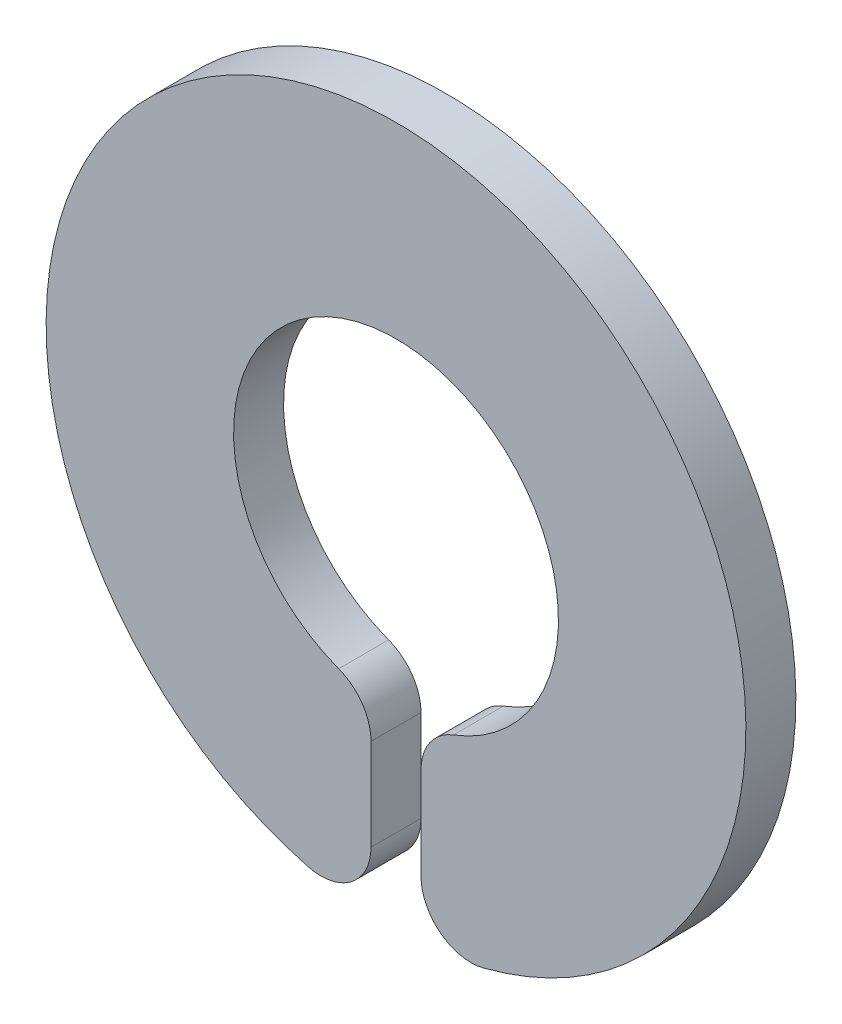
ISO-10303-21;
HEADER;
FILE_DESCRIPTION(('STEP AP214'),'2;1');
FILE_NAME('part.step','',(''),(''),'','','');
FILE_SCHEMA(('AUTOMOTIVE_DESIGN { 1 0 10303 214 1 1 1 1 }'));
ENDSEC;
DATA;
#1=APPLICATION_CONTEXT('core data for automotive mechanical design processes');
#2=APPLICATION_PROTOCOL_DEFINITION('international standard','automotive_design',2000,#1);
#3=PRODUCT_CONTEXT('',#1,'mechanical');
#4=PRODUCT('Part','Part','',(#3));
#5=PRODUCT_RELATED_PRODUCT_CATEGORY('part','',(#4));
#6=PRODUCT_DEFINITION_FORMATION('','',#4);
#7=PRODUCT_DEFINITION_CONTEXT('part definition',#1,'design');
#8=PRODUCT_DEFINITION('design','',#6,#7);
#9=PRODUCT_DEFINITION_SHAPE('','',#8);
#10=(LENGTH_UNIT() NAMED_UNIT(*) SI_UNIT(.MILLI.,.METRE.));
#11=(NAMED_UNIT(*) PLANE_ANGLE_UNIT() SI_UNIT($,.RADIAN.));
#12=(NAMED_UNIT(*) SI_UNIT($,.STERADIAN.) SOLID_ANGLE_UNIT());
#13=UNCERTAINTY_MEASURE_WITH_UNIT(LENGTH_MEASURE(1.E-05),#10,'distance_accuracy_value','');
#14=(GEOMETRIC_REPRESENTATION_CONTEXT(3) GLOBAL_UNCERTAINTY_ASSIGNED_CONTEXT((#13)) GLOBAL_UNIT_ASSIGNED_CONTEXT((#10,
#11,#12)) REPRESENTATION_CONTEXT('',''));
#15=CARTESIAN_POINT('',(0.,0.,0.));
#16=DIRECTION('',(0.,0.,1.));
#17=DIRECTION('',(1.,0.,0.));
#18=AXIS2_PLACEMENT_3D('',#15,#16,#17);
#19=CARTESIAN_POINT('',(0.,0.,1.));
#20=DIRECTION('',(0.,0.,-1.));
#21=DIRECTION('',(-1.,0.,0.));
#22=AXIS2_PLACEMENT_3D('',#19,#20,#21);
#23=CYLINDRICAL_SURFACE('',#22,3.25);
#24=CARTESIAN_POINT('',(0.,0.,0.));
#25=DIRECTION('',(0.,0.,-1.));
#26=DIRECTION('',(1.,0.,0.));
#27=AXIS2_PLACEMENT_3D('',#24,#25,#26);
#28=CIRCLE('',#27,3.25);
#29=CARTESIAN_POINT('',(-1.14705882352941,-3.04084791717102,0.));
#30=VERTEX_POINT('',#29);
#31=CARTESIAN_POINT('',(1.14705882352941,-3.04084791717102,0.));
#32=VERTEX_POINT('',#31);
#33=EDGE_CURVE('E128',#30,#32,#28,.T.);
#34=ORIENTED_EDGE('',*,*,#33,.T.);
#35=DIRECTION('',(0.,0.,-1.));
#36=VECTOR('',#35,1.);
#37=CARTESIAN_POINT('',(1.14705882352941,-3.04084791717102,1.));
#38=LINE('',#37,#36);
#39=CARTESIAN_POINT('',(1.14705882352941,-3.04084791717102,1.));
#40=VERTEX_POINT('',#39);
#41=EDGE_CURVE('E11',#32,#40,#38,.F.);
#42=ORIENTED_EDGE('',*,*,#41,.T.);
#43=CARTESIAN_POINT('',(0.,0.,1.));
#44=DIRECTION('',(0.,0.,-1.));
#45=DIRECTION('',(1.,0.,0.));
#46=AXIS2_PLACEMENT_3D('',#43,#44,#45);
#47=CIRCLE('',#46,3.25);
#48=CARTESIAN_POINT('',(-1.14705882352941,-3.04084791717102,1.));
#49=VERTEX_POINT('',#48);
#50=EDGE_CURVE('E126',#49,#40,#47,.T.);
#51=ORIENTED_EDGE('',*,*,#50,.F.);
#52=DIRECTION('',(0.,0.,-1.));
#53=VECTOR('',#52,1.);
#54=CARTESIAN_POINT('',(-1.14705882352941,-3.04084791717102,1.));
#55=LINE('',#54,#53);
#56=EDGE_CURVE('E40',#49,#30,#55,.T.);
#57=ORIENTED_EDGE('',*,*,#56,.T.);
#58=EDGE_LOOP('',(#34,#42,#51,#57));
#59=FACE_BOUND('',#58,.T.);
#60=ADVANCED_FACE('F32',(#59),#23,.F.);
#61=CARTESIAN_POINT('',(0.499999999999999,-3.21130814466628,1.));
#62=DIRECTION('',(1.,0.,0.));
#63=DIRECTION('',(0.,1.,0.));
#64=AXIS2_PLACEMENT_3D('',#61,#62,#63);
#65=PLANE('',#64);
#66=DIRECTION('',(0.,-1.,0.));
#67=VECTOR('',#66,1.);
#68=CARTESIAN_POINT('',(0.499999999999999,-3.21130814466628,0.));
#69=LINE('',#68,#67);
#70=CARTESIAN_POINT('',(0.499999999999999,-3.97649343014672,0.));
#71=VERTEX_POINT('',#70);
#72=CARTESIAN_POINT('',(0.499999999999999,-5.80947501931113,0.));
#73=VERTEX_POINT('',#72);
#74=EDGE_CURVE('E124',#71,#73,#69,.T.);
#75=ORIENTED_EDGE('',*,*,#74,.T.);
#76=DIRECTION('',(0.,0.,-1.));
#77=VECTOR('',#76,1.);
#78=CARTESIAN_POINT('',(0.499999999999999,-5.80947501931113,1.));
#79=LINE('',#78,#77);
#80=CARTESIAN_POINT('',(0.499999999999999,-5.80947501931113,1.));
#81=VERTEX_POINT('',#80);
#82=EDGE_CURVE('E103',#73,#81,#79,.F.);
#83=ORIENTED_EDGE('',*,*,#82,.T.);
#84=DIRECTION('',(0.,-1.,0.));
#85=VECTOR('',#84,1.);
#86=CARTESIAN_POINT('',(0.499999999999999,-3.21130814466628,1.));
#87=LINE('',#86,#85);
#88=CARTESIAN_POINT('',(0.499999999999999,-3.97649343014672,1.));
#89=VERTEX_POINT('',#88);
#90=EDGE_CURVE('E164',#89,#81,#87,.T.);
#91=ORIENTED_EDGE('',*,*,#90,.F.);
#92=DIRECTION('',(0.,0.,-1.));
#93=VECTOR('',#92,1.);
#94=CARTESIAN_POINT('',(0.499999999999999,-3.97649343014672,1.));
#95=LINE('',#94,#93);
#96=EDGE_CURVE('E108',#89,#71,#95,.T.);
#97=ORIENTED_EDGE('',*,*,#96,.T.);
#98=EDGE_LOOP('',(#75,#83,#91,#97));
#99=FACE_BOUND('',#98,.T.);
#100=ADVANCED_FACE('F174',(#99),#65,.F.);
#101=CARTESIAN_POINT('',(0.,0.,1.));
#102=DIRECTION('',(0.,0.,-1.));
#103=DIRECTION('',(-1.,0.,0.));
#104=AXIS2_PLACEMENT_3D('',#101,#102,#103);
#105=CYLINDRICAL_SURFACE('',#104,7.);
#106=CARTESIAN_POINT('',(0.,0.,1.));
#107=DIRECTION('',(0.,0.,1.));
#108=DIRECTION('',(1.,0.,0.));
#109=AXIS2_PLACEMENT_3D('',#106,#107,#108);
#110=CIRCLE('',#109,7.);
#111=CARTESIAN_POINT('',(1.75,-6.77772085586298,1.));
#112=VERTEX_POINT('',#111);
#113=CARTESIAN_POINT('',(-1.75,-6.77772085586298,1.));
#114=VERTEX_POINT('',#113);
#115=EDGE_CURVE('E117',#112,#114,#110,.T.);
#116=ORIENTED_EDGE('',*,*,#115,.F.);
#117=DIRECTION('',(0.,0.,-1.));
#118=VECTOR('',#117,1.);
#119=CARTESIAN_POINT('',(1.75,-6.77772085586298,1.));
#120=LINE('',#119,#118);
#121=CARTESIAN_POINT('',(1.75,-6.77772085586298,0.));
#122=VERTEX_POINT('',#121);
#123=EDGE_CURVE('E102',#112,#122,#120,.T.);
#124=ORIENTED_EDGE('',*,*,#123,.T.);
#125=CARTESIAN_POINT('',(0.,0.,0.));
#126=DIRECTION('',(0.,0.,1.));
#127=DIRECTION('',(1.,0.,0.));
#128=AXIS2_PLACEMENT_3D('',#125,#126,#127);
#129=CIRCLE('',#128,7.);
#130=CARTESIAN_POINT('',(-1.75,-6.77772085586298,0.));
#131=VERTEX_POINT('',#130);
#132=EDGE_CURVE('E115',#122,#131,#129,.T.);
#133=ORIENTED_EDGE('',*,*,#132,.T.);
#134=DIRECTION('',(0.,0.,-1.));
#135=VECTOR('',#134,1.);
#136=CARTESIAN_POINT('',(-1.75,-6.77772085586298,1.));
#137=LINE('',#136,#135);
#138=EDGE_CURVE('E119',#131,#114,#137,.F.);
#139=ORIENTED_EDGE('',*,*,#138,.T.);
#140=EDGE_LOOP('',(#116,#124,#133,#139));
#141=FACE_BOUND('',#140,.T.);
#142=ADVANCED_FACE('F114',(#141),#105,.T.);
#143=CARTESIAN_POINT('',(-0.499999999999999,-3.21130814466628,1.));
#144=DIRECTION('',(-1.,0.,0.));
#145=DIRECTION('',(0.,-1.,0.));
#146=AXIS2_PLACEMENT_3D('',#143,#144,#145);
#147=PLANE('',#146);
#148=DIRECTION('',(0.,1.,0.));
#149=VECTOR('',#148,1.);
#150=CARTESIAN_POINT('',(-0.499999999999999,-3.21130814466628,1.));
#151=LINE('',#150,#149);
#152=CARTESIAN_POINT('',(-0.499999999999999,-5.80947501931113,1.));
#153=VERTEX_POINT('',#152);
#154=CARTESIAN_POINT('',(-0.499999999999999,-3.97649343014672,1.));
#155=VERTEX_POINT('',#154);
#156=EDGE_CURVE('E132',#153,#155,#151,.T.);
#157=ORIENTED_EDGE('',*,*,#156,.F.);
#158=DIRECTION('',(0.,0.,-1.));
#159=VECTOR('',#158,1.);
#160=CARTESIAN_POINT('',(-0.499999999999999,-5.80947501931113,1.));
#161=LINE('',#160,#159);
#162=CARTESIAN_POINT('',(-0.499999999999999,-5.80947501931113,0.));
#163=VERTEX_POINT('',#162);
#164=EDGE_CURVE('E149',#153,#163,#161,.T.);
#165=ORIENTED_EDGE('',*,*,#164,.T.);
#166=DIRECTION('',(0.,1.,0.));
#167=VECTOR('',#166,1.);
#168=CARTESIAN_POINT('',(-0.499999999999999,-3.21130814466628,0.));
#169=LINE('',#168,#167);
#170=CARTESIAN_POINT('',(-0.499999999999999,-3.97649343014672,0.));
#171=VERTEX_POINT('',#170);
#172=EDGE_CURVE('E123',#163,#171,#169,.T.);
#173=ORIENTED_EDGE('',*,*,#172,.T.);
#174=DIRECTION('',(0.,0.,-1.));
#175=VECTOR('',#174,1.);
#176=CARTESIAN_POINT('',(-0.499999999999999,-3.97649343014672,1.));
#177=LINE('',#176,#175);
#178=EDGE_CURVE('E47',#171,#155,#177,.F.);
#179=ORIENTED_EDGE('',*,*,#178,.T.);
#180=EDGE_LOOP('',(#157,#165,#173,#179));
#181=FACE_BOUND('',#180,.T.);
#182=ADVANCED_FACE('F178',(#181),#147,.F.);
#183=CARTESIAN_POINT('',(0.,0.,1.));
#184=DIRECTION('',(0.,0.,1.));
#185=DIRECTION('',(1.,0.,0.));
#186=AXIS2_PLACEMENT_3D('',#183,#184,#185);
#187=PLANE('',#186);
#188=ORIENTED_EDGE('',*,*,#90,.T.);
#189=CARTESIAN_POINT('',(1.5,-5.80947501931113,1.));
#190=DIRECTION('',(0.,0.,1.));
#191=DIRECTION('',(1.,0.,0.));
#192=AXIS2_PLACEMENT_3D('',#189,#190,#191);
#193=CIRCLE('',#192,1.);
#194=EDGE_CURVE('E146',#81,#112,#193,.T.);
#195=ORIENTED_EDGE('',*,*,#194,.T.);
#196=ORIENTED_EDGE('',*,*,#115,.T.);
#197=CARTESIAN_POINT('',(-1.5,-5.80947501931113,1.));
#198=DIRECTION('',(0.,0.,1.));
#199=DIRECTION('',(1.,0.,0.));
#200=AXIS2_PLACEMENT_3D('',#197,#198,#199);
#201=CIRCLE('',#200,1.);
#202=EDGE_CURVE('E54',#114,#153,#201,.T.);
#203=ORIENTED_EDGE('',*,*,#202,.T.);
#204=ORIENTED_EDGE('',*,*,#156,.T.);
#205=CARTESIAN_POINT('',(-1.5,-3.97649343014672,1.));
#206=DIRECTION('',(0.,0.,1.));
#207=DIRECTION('',(1.,0.,0.));
#208=AXIS2_PLACEMENT_3D('',#205,#206,#207);
#209=CIRCLE('',#208,1.);
#210=EDGE_CURVE('E141',#155,#49,#209,.T.);
#211=ORIENTED_EDGE('',*,*,#210,.T.);
#212=ORIENTED_EDGE('',*,*,#50,.T.);
#213=CARTESIAN_POINT('',(1.5,-3.97649343014672,1.));
#214=DIRECTION('',(0.,0.,1.));
#215=DIRECTION('',(1.,0.,0.));
#216=AXIS2_PLACEMENT_3D('',#213,#214,#215);
#217=CIRCLE('',#216,1.);
#218=EDGE_CURVE('E143',#40,#89,#217,.T.);
#219=ORIENTED_EDGE('',*,*,#218,.T.);
#220=EDGE_LOOP('',(#188,#195,#196,#203,#204,#211,#212,#219));
#221=FACE_BOUND('',#220,.T.);
#222=ADVANCED_FACE('F168',(#221),#187,.T.);
#223=CARTESIAN_POINT('',(0.,0.,0.));
#224=DIRECTION('',(0.,0.,1.));
#225=DIRECTION('',(1.,0.,0.));
#226=AXIS2_PLACEMENT_3D('',#223,#224,#225);
#227=PLANE('',#226);
#228=ORIENTED_EDGE('',*,*,#132,.F.);
#229=CARTESIAN_POINT('',(1.5,-5.80947501931113,0.));
#230=DIRECTION('',(0.,0.,1.));
#231=DIRECTION('',(1.,0.,0.));
#232=AXIS2_PLACEMENT_3D('',#229,#230,#231);
#233=CIRCLE('',#232,1.);
#234=EDGE_CURVE('E98',#122,#73,#233,.F.);
#235=ORIENTED_EDGE('',*,*,#234,.T.);
#236=ORIENTED_EDGE('',*,*,#74,.F.);
#237=CARTESIAN_POINT('',(1.5,-3.97649343014672,0.));
#238=DIRECTION('',(0.,0.,1.));
#239=DIRECTION('',(1.,0.,0.));
#240=AXIS2_PLACEMENT_3D('',#237,#238,#239);
#241=CIRCLE('',#240,1.);
#242=EDGE_CURVE('E135',#71,#32,#241,.F.);
#243=ORIENTED_EDGE('',*,*,#242,.T.);
#244=ORIENTED_EDGE('',*,*,#33,.F.);
#245=CARTESIAN_POINT('',(-1.5,-3.97649343014672,0.));
#246=DIRECTION('',(0.,0.,1.));
#247=DIRECTION('',(1.,0.,0.));
#248=AXIS2_PLACEMENT_3D('',#245,#246,#247);
#249=CIRCLE('',#248,1.);
#250=EDGE_CURVE('E118',#30,#171,#249,.F.);
#251=ORIENTED_EDGE('',*,*,#250,.T.);
#252=ORIENTED_EDGE('',*,*,#172,.F.);
#253=CARTESIAN_POINT('',(-1.5,-5.80947501931113,0.));
#254=DIRECTION('',(0.,0.,1.));
#255=DIRECTION('',(1.,0.,0.));
#256=AXIS2_PLACEMENT_3D('',#253,#254,#255);
#257=CIRCLE('',#256,1.);
#258=EDGE_CURVE('E109',#163,#131,#257,.F.);
#259=ORIENTED_EDGE('',*,*,#258,.T.);
#260=EDGE_LOOP('',(#228,#235,#236,#243,#244,#251,#252,#259));
#261=FACE_BOUND('',#260,.T.);
#262=ADVANCED_FACE('F121',(#261),#227,.F.);
#263=CARTESIAN_POINT('',(1.5,-5.80947501931113,1.));
#264=DIRECTION('',(0.,0.,-1.));
#265=DIRECTION('',(-1.,0.,0.));
#266=AXIS2_PLACEMENT_3D('',#263,#264,#265);
#267=CYLINDRICAL_SURFACE('',#266,1.);
#268=ORIENTED_EDGE('',*,*,#194,.F.);
#269=ORIENTED_EDGE('',*,*,#82,.F.);
#270=ORIENTED_EDGE('',*,*,#234,.F.);
#271=ORIENTED_EDGE('',*,*,#123,.F.);
#272=EDGE_LOOP('',(#268,#269,#270,#271));
#273=FACE_BOUND('',#272,.T.);
#274=ADVANCED_FACE('F101',(#273),#267,.T.);
#275=CARTESIAN_POINT('',(-1.5,-5.80947501931113,1.));
#276=DIRECTION('',(0.,0.,-1.));
#277=DIRECTION('',(-1.,0.,0.));
#278=AXIS2_PLACEMENT_3D('',#275,#276,#277);
#279=CYLINDRICAL_SURFACE('',#278,1.);
#280=ORIENTED_EDGE('',*,*,#202,.F.);
#281=ORIENTED_EDGE('',*,*,#138,.F.);
#282=ORIENTED_EDGE('',*,*,#258,.F.);
#283=ORIENTED_EDGE('',*,*,#164,.F.);
#284=EDGE_LOOP('',(#280,#281,#282,#283));
#285=FACE_BOUND('',#284,.T.);
#286=ADVANCED_FACE('F177',(#285),#279,.T.);
#287=CARTESIAN_POINT('',(1.5,-3.97649343014672,1.));
#288=DIRECTION('',(0.,0.,-1.));
#289=DIRECTION('',(-1.,0.,0.));
#290=AXIS2_PLACEMENT_3D('',#287,#288,#289);
#291=CYLINDRICAL_SURFACE('',#290,1.);
#292=ORIENTED_EDGE('',*,*,#218,.F.);
#293=ORIENTED_EDGE('',*,*,#41,.F.);
#294=ORIENTED_EDGE('',*,*,#242,.F.);
#295=ORIENTED_EDGE('',*,*,#96,.F.);
#296=EDGE_LOOP('',(#292,#293,#294,#295));
#297=FACE_BOUND('',#296,.T.);
#298=ADVANCED_FACE('F172',(#297),#291,.T.);
#299=CARTESIAN_POINT('',(-1.5,-3.97649343014672,1.));
#300=DIRECTION('',(0.,0.,-1.));
#301=DIRECTION('',(-1.,0.,0.));
#302=AXIS2_PLACEMENT_3D('',#299,#300,#301);
#303=CYLINDRICAL_SURFACE('',#302,1.);
#304=ORIENTED_EDGE('',*,*,#210,.F.);
#305=ORIENTED_EDGE('',*,*,#178,.F.);
#306=ORIENTED_EDGE('',*,*,#250,.F.);
#307=ORIENTED_EDGE('',*,*,#56,.F.);
#308=EDGE_LOOP('',(#304,#305,#306,#307));
#309=FACE_BOUND('',#308,.T.);
#310=ADVANCED_FACE('F34',(#309),#303,.T.);
#311=CLOSED_SHELL('',(#60,#100,#142,#182,#222,#262,#274,#286,#298,#310));
#312=MANIFOLD_SOLID_BREP('B2',#311);
#313=ADVANCED_BREP_SHAPE_REPRESENTATION('',(#18,#312),#14);
#314=SHAPE_DEFINITION_REPRESENTATION(#9,#313);
ENDSEC;
END-ISO-10303-21;
